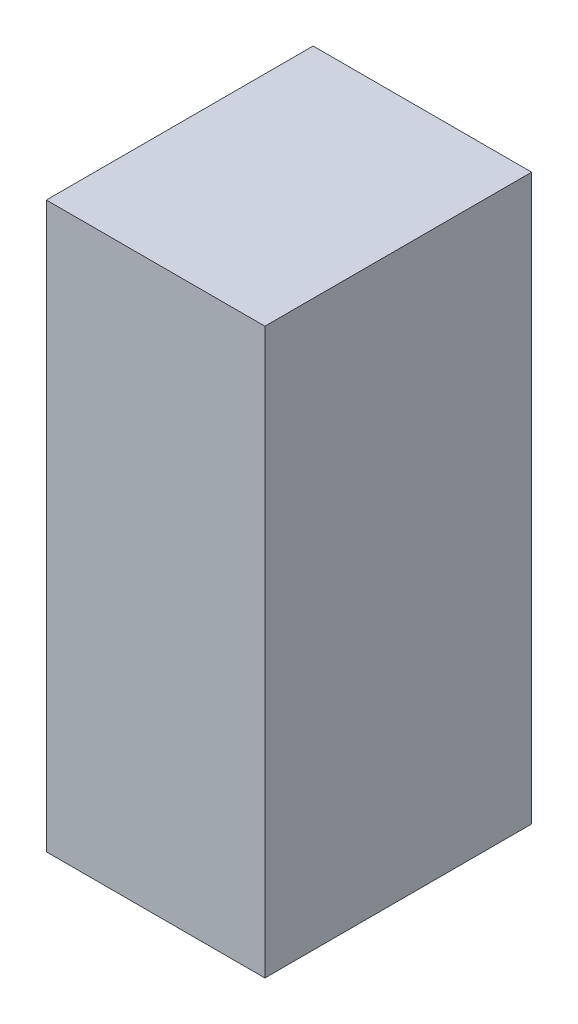
ISO-10303-21;
HEADER;
FILE_DESCRIPTION(('STEP AP214'),'2;1');
FILE_NAME('part.step','',(''),(''),'','','');
FILE_SCHEMA(('AUTOMOTIVE_DESIGN { 1 0 10303 214 1 1 1 1 }'));
ENDSEC;
DATA;
#1=APPLICATION_CONTEXT('core data for automotive mechanical design processes');
#2=APPLICATION_PROTOCOL_DEFINITION('international standard','automotive_design',2000,#1);
#3=PRODUCT_CONTEXT('',#1,'mechanical');
#4=PRODUCT('Part','Part','',(#3));
#5=PRODUCT_RELATED_PRODUCT_CATEGORY('part','',(#4));
#6=PRODUCT_DEFINITION_FORMATION('','',#4);
#7=PRODUCT_DEFINITION_CONTEXT('part definition',#1,'design');
#8=PRODUCT_DEFINITION('design','',#6,#7);
#9=PRODUCT_DEFINITION_SHAPE('','',#8);
#10=(LENGTH_UNIT() NAMED_UNIT(*) SI_UNIT(.MILLI.,.METRE.));
#11=(NAMED_UNIT(*) PLANE_ANGLE_UNIT() SI_UNIT($,.RADIAN.));
#12=(NAMED_UNIT(*) SI_UNIT($,.STERADIAN.) SOLID_ANGLE_UNIT());
#13=UNCERTAINTY_MEASURE_WITH_UNIT(LENGTH_MEASURE(1.E-05),#10,'distance_accuracy_value','');
#14=(GEOMETRIC_REPRESENTATION_CONTEXT(3) GLOBAL_UNCERTAINTY_ASSIGNED_CONTEXT((#13)) GLOBAL_UNIT_ASSIGNED_CONTEXT((#10,
#11,#12)) REPRESENTATION_CONTEXT('',''));
#15=CARTESIAN_POINT('',(0.,0.,0.));
#16=DIRECTION('',(0.,0.,1.));
#17=DIRECTION('',(1.,0.,0.));
#18=AXIS2_PLACEMENT_3D('',#15,#16,#17);
#19=CARTESIAN_POINT('',(0.,0.,22.));
#20=DIRECTION('',(1.,0.,0.));
#21=DIRECTION('',(0.,0.,-1.));
#22=AXIS2_PLACEMENT_3D('',#19,#20,#21);
#23=PLANE('',#22);
#24=DIRECTION('',(0.,-1.,0.));
#25=VECTOR('',#24,1.);
#26=CARTESIAN_POINT('',(0.,0.,0.));
#27=LINE('',#26,#25);
#28=CARTESIAN_POINT('',(0.,46.5564829141397,0.));
#29=VERTEX_POINT('',#28);
#30=CARTESIAN_POINT('',(0.,0.,0.));
#31=VERTEX_POINT('',#30);
#32=EDGE_CURVE('E107',#29,#31,#27,.T.);
#33=ORIENTED_EDGE('',*,*,#32,.T.);
#34=DIRECTION('',(0.,0.,-1.));
#35=VECTOR('',#34,1.);
#36=CARTESIAN_POINT('',(0.,0.,22.));
#37=LINE('',#36,#35);
#38=CARTESIAN_POINT('',(0.,0.,22.));
#39=VERTEX_POINT('',#38);
#40=EDGE_CURVE('E11',#39,#31,#37,.T.);
#41=ORIENTED_EDGE('',*,*,#40,.F.);
#42=DIRECTION('',(0.,-1.,0.));
#43=VECTOR('',#42,1.);
#44=CARTESIAN_POINT('',(0.,0.,22.));
#45=LINE('',#44,#43);
#46=CARTESIAN_POINT('',(0.,46.5564829141397,22.));
#47=VERTEX_POINT('',#46);
#48=EDGE_CURVE('E91',#47,#39,#45,.T.);
#49=ORIENTED_EDGE('',*,*,#48,.F.);
#50=DIRECTION('',(0.,0.,-1.));
#51=VECTOR('',#50,1.);
#52=CARTESIAN_POINT('',(0.,46.5564829141397,22.));
#53=LINE('',#52,#51);
#54=EDGE_CURVE('E103',#47,#29,#53,.T.);
#55=ORIENTED_EDGE('',*,*,#54,.T.);
#56=EDGE_LOOP('',(#33,#41,#49,#55));
#57=FACE_BOUND('',#56,.T.);
#58=ADVANCED_FACE('F39',(#57),#23,.F.);
#59=CARTESIAN_POINT('',(0.,0.,22.));
#60=DIRECTION('',(0.,1.,0.));
#61=DIRECTION('',(0.,0.,1.));
#62=AXIS2_PLACEMENT_3D('',#59,#60,#61);
#63=PLANE('',#62);
#64=DIRECTION('',(1.,0.,0.));
#65=VECTOR('',#64,1.);
#66=CARTESIAN_POINT('',(0.,0.,0.));
#67=LINE('',#66,#65);
#68=CARTESIAN_POINT('',(18.0229763223119,0.,0.));
#69=VERTEX_POINT('',#68);
#70=EDGE_CURVE('E96',#31,#69,#67,.T.);
#71=ORIENTED_EDGE('',*,*,#70,.T.);
#72=DIRECTION('',(0.,0.,-1.));
#73=VECTOR('',#72,1.);
#74=CARTESIAN_POINT('',(18.0229763223119,0.,22.));
#75=LINE('',#74,#73);
#76=CARTESIAN_POINT('',(18.0229763223119,0.,22.));
#77=VERTEX_POINT('',#76);
#78=EDGE_CURVE('E48',#77,#69,#75,.T.);
#79=ORIENTED_EDGE('',*,*,#78,.F.);
#80=DIRECTION('',(1.,0.,0.));
#81=VECTOR('',#80,1.);
#82=CARTESIAN_POINT('',(0.,0.,22.));
#83=LINE('',#82,#81);
#84=EDGE_CURVE('E86',#39,#77,#83,.T.);
#85=ORIENTED_EDGE('',*,*,#84,.F.);
#86=ORIENTED_EDGE('',*,*,#40,.T.);
#87=EDGE_LOOP('',(#71,#79,#85,#86));
#88=FACE_BOUND('',#87,.T.);
#89=ADVANCED_FACE('F95',(#88),#63,.F.);
#90=CARTESIAN_POINT('',(18.0229763223119,0.,22.));
#91=DIRECTION('',(-1.,0.,0.));
#92=DIRECTION('',(0.,0.,1.));
#93=AXIS2_PLACEMENT_3D('',#90,#91,#92);
#94=PLANE('',#93);
#95=DIRECTION('',(0.,1.,0.));
#96=VECTOR('',#95,1.);
#97=CARTESIAN_POINT('',(18.0229763223119,0.,0.));
#98=LINE('',#97,#96);
#99=CARTESIAN_POINT('',(18.0229763223119,46.5564829141397,0.));
#100=VERTEX_POINT('',#99);
#101=EDGE_CURVE('E73',#69,#100,#98,.T.);
#102=ORIENTED_EDGE('',*,*,#101,.T.);
#103=DIRECTION('',(0.,0.,-1.));
#104=VECTOR('',#103,1.);
#105=CARTESIAN_POINT('',(18.0229763223119,46.5564829141397,22.));
#106=LINE('',#105,#104);
#107=CARTESIAN_POINT('',(18.0229763223119,46.5564829141397,22.));
#108=VERTEX_POINT('',#107);
#109=EDGE_CURVE('E98',#108,#100,#106,.T.);
#110=ORIENTED_EDGE('',*,*,#109,.F.);
#111=DIRECTION('',(0.,1.,0.));
#112=VECTOR('',#111,1.);
#113=CARTESIAN_POINT('',(18.0229763223119,0.,22.));
#114=LINE('',#113,#112);
#115=EDGE_CURVE('E89',#77,#108,#114,.T.);
#116=ORIENTED_EDGE('',*,*,#115,.F.);
#117=ORIENTED_EDGE('',*,*,#78,.T.);
#118=EDGE_LOOP('',(#102,#110,#116,#117));
#119=FACE_BOUND('',#118,.T.);
#120=ADVANCED_FACE('F99',(#119),#94,.F.);
#121=CARTESIAN_POINT('',(0.,46.5564829141397,22.));
#122=DIRECTION('',(0.,-1.,0.));
#123=DIRECTION('',(0.,0.,-1.));
#124=AXIS2_PLACEMENT_3D('',#121,#122,#123);
#125=PLANE('',#124);
#126=DIRECTION('',(-1.,0.,0.));
#127=VECTOR('',#126,1.);
#128=CARTESIAN_POINT('',(0.,46.5564829141397,0.));
#129=LINE('',#128,#127);
#130=EDGE_CURVE('E79',#100,#29,#129,.T.);
#131=ORIENTED_EDGE('',*,*,#130,.T.);
#132=ORIENTED_EDGE('',*,*,#54,.F.);
#133=DIRECTION('',(-1.,0.,0.));
#134=VECTOR('',#133,1.);
#135=CARTESIAN_POINT('',(0.,46.5564829141397,22.));
#136=LINE('',#135,#134);
#137=EDGE_CURVE('E56',#108,#47,#136,.T.);
#138=ORIENTED_EDGE('',*,*,#137,.F.);
#139=ORIENTED_EDGE('',*,*,#109,.T.);
#140=EDGE_LOOP('',(#131,#132,#138,#139));
#141=FACE_BOUND('',#140,.T.);
#142=ADVANCED_FACE('F120',(#141),#125,.F.);
#143=CARTESIAN_POINT('',(0.,0.,22.));
#144=DIRECTION('',(0.,0.,-1.));
#145=DIRECTION('',(-1.,0.,0.));
#146=AXIS2_PLACEMENT_3D('',#143,#144,#145);
#147=PLANE('',#146);
#148=ORIENTED_EDGE('',*,*,#48,.T.);
#149=ORIENTED_EDGE('',*,*,#84,.T.);
#150=ORIENTED_EDGE('',*,*,#115,.T.);
#151=ORIENTED_EDGE('',*,*,#137,.T.);
#152=EDGE_LOOP('',(#148,#149,#150,#151));
#153=FACE_BOUND('',#152,.T.);
#154=ADVANCED_FACE('F87',(#153),#147,.F.);
#155=CARTESIAN_POINT('',(0.,0.,0.));
#156=DIRECTION('',(0.,0.,-1.));
#157=DIRECTION('',(-1.,0.,0.));
#158=AXIS2_PLACEMENT_3D('',#155,#156,#157);
#159=PLANE('',#158);
#160=ORIENTED_EDGE('',*,*,#32,.F.);
#161=ORIENTED_EDGE('',*,*,#130,.F.);
#162=ORIENTED_EDGE('',*,*,#101,.F.);
#163=ORIENTED_EDGE('',*,*,#70,.F.);
#164=EDGE_LOOP('',(#160,#161,#162,#163));
#165=FACE_BOUND('',#164,.T.);
#166=ADVANCED_FACE('F123',(#165),#159,.T.);
#167=CLOSED_SHELL('',(#58,#89,#120,#142,#154,#166));
#168=MANIFOLD_SOLID_BREP('B2',#167);
#169=ADVANCED_BREP_SHAPE_REPRESENTATION('',(#18,#168),#14);
#170=SHAPE_DEFINITION_REPRESENTATION(#9,#169);
ENDSEC;
END-ISO-10303-21;
